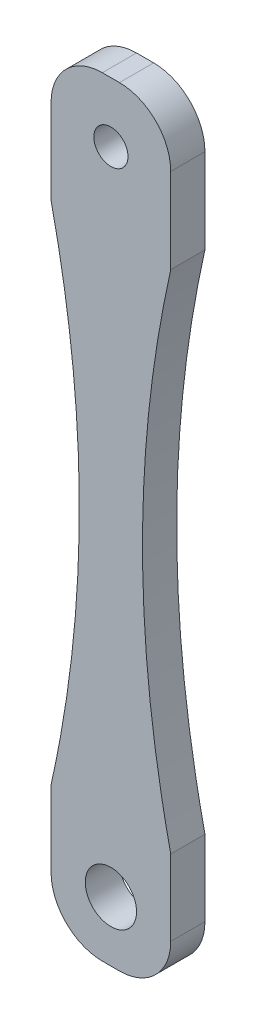
ISO-10303-21;
HEADER;
FILE_DESCRIPTION(('STEP AP214'),'2;1');
FILE_NAME('part.step','',(''),(''),'','','');
FILE_SCHEMA(('AUTOMOTIVE_DESIGN { 1 0 10303 214 1 1 1 1 }'));
ENDSEC;
DATA;
#1=APPLICATION_CONTEXT('core data for automotive mechanical design processes');
#2=APPLICATION_PROTOCOL_DEFINITION('international standard','automotive_design',2000,#1);
#3=PRODUCT_CONTEXT('',#1,'mechanical');
#4=PRODUCT('Part','Part','',(#3));
#5=PRODUCT_RELATED_PRODUCT_CATEGORY('part','',(#4));
#6=PRODUCT_DEFINITION_FORMATION('','',#4);
#7=PRODUCT_DEFINITION_CONTEXT('part definition',#1,'design');
#8=PRODUCT_DEFINITION('design','',#6,#7);
#9=PRODUCT_DEFINITION_SHAPE('','',#8);
#10=(LENGTH_UNIT() NAMED_UNIT(*) SI_UNIT(.MILLI.,.METRE.));
#11=(NAMED_UNIT(*) PLANE_ANGLE_UNIT() SI_UNIT($,.RADIAN.));
#12=(NAMED_UNIT(*) SI_UNIT($,.STERADIAN.) SOLID_ANGLE_UNIT());
#13=UNCERTAINTY_MEASURE_WITH_UNIT(LENGTH_MEASURE(1.E-05),#10,'distance_accuracy_value','');
#14=(GEOMETRIC_REPRESENTATION_CONTEXT(3) GLOBAL_UNCERTAINTY_ASSIGNED_CONTEXT((#13)) GLOBAL_UNIT_ASSIGNED_CONTEXT((#10,
#11,#12)) REPRESENTATION_CONTEXT('',''));
#15=CARTESIAN_POINT('',(0.,0.,0.));
#16=DIRECTION('',(0.,0.,1.));
#17=DIRECTION('',(1.,0.,0.));
#18=AXIS2_PLACEMENT_3D('',#15,#16,#17);
#19=CARTESIAN_POINT('',(3.5,19.5,2.));
#20=DIRECTION('',(-1.,0.,0.));
#21=DIRECTION('',(0.,-1.,0.));
#22=AXIS2_PLACEMENT_3D('',#19,#20,#21);
#23=PLANE('',#22);
#24=DIRECTION('',(0.,1.,0.));
#25=VECTOR('',#24,1.);
#26=CARTESIAN_POINT('',(3.5,19.5,2.));
#27=LINE('',#26,#25);
#28=CARTESIAN_POINT('',(3.5,14.5304638728839,2.));
#29=VERTEX_POINT('',#28);
#30=CARTESIAN_POINT('',(3.5,19.5,2.));
#31=VERTEX_POINT('',#30);
#32=EDGE_CURVE('E129',#29,#31,#27,.T.);
#33=ORIENTED_EDGE('',*,*,#32,.F.);
#34=DIRECTION('',(0.,0.,1.));
#35=VECTOR('',#34,1.);
#36=CARTESIAN_POINT('',(3.5,14.5304638728839,-12.));
#37=LINE('',#36,#35);
#38=CARTESIAN_POINT('',(3.5,14.5304638728839,0.));
#39=VERTEX_POINT('',#38);
#40=EDGE_CURVE('E11',#29,#39,#37,.F.);
#41=ORIENTED_EDGE('',*,*,#40,.T.);
#42=DIRECTION('',(0.,1.,0.));
#43=VECTOR('',#42,1.);
#44=CARTESIAN_POINT('',(3.5,19.5,0.));
#45=LINE('',#44,#43);
#46=CARTESIAN_POINT('',(3.5,19.5,0.));
#47=VERTEX_POINT('',#46);
#48=EDGE_CURVE('E162',#39,#47,#45,.T.);
#49=ORIENTED_EDGE('',*,*,#48,.T.);
#50=DIRECTION('',(0.,0.,-1.));
#51=VECTOR('',#50,1.);
#52=CARTESIAN_POINT('',(3.5,19.5,2.));
#53=LINE('',#52,#51);
#54=EDGE_CURVE('E135',#31,#47,#53,.T.);
#55=ORIENTED_EDGE('',*,*,#54,.F.);
#56=EDGE_LOOP('',(#33,#41,#49,#55));
#57=FACE_BOUND('',#56,.T.);
#58=ADVANCED_FACE('F33',(#57),#23,.F.);
#59=CARTESIAN_POINT('',(-0.499999999999998,-19.5,2.));
#60=DIRECTION('',(0.,0.,1.));
#61=DIRECTION('',(1.,0.,0.));
#62=AXIS2_PLACEMENT_3D('',#59,#60,#61);
#63=PLANE('',#62);
#64=CARTESIAN_POINT('',(3.5,14.5304638728839,2.));
#65=CARTESIAN_POINT('',(0.195046466559805,-0.263066887007442,2.));
#66=CARTESIAN_POINT('',(3.50000000000001,-15.0698812217126,2.));
#67=B_SPLINE_CURVE_WITH_KNOTS('',2,(#64,#65,#66),.UNSPECIFIED.,.F.,.F.,(3,3),(0.,1.),.UNSPECIFIED.);
#68=CARTESIAN_POINT('',(3.5,-15.0698812217126,2.));
#69=VERTEX_POINT('',#68);
#70=EDGE_CURVE('E48',#29,#69,#67,.T.);
#71=ORIENTED_EDGE('',*,*,#70,.F.);
#72=ORIENTED_EDGE('',*,*,#32,.T.);
#73=CARTESIAN_POINT('',(0.499999999999997,19.5,2.));
#74=DIRECTION('',(0.,0.,1.));
#75=DIRECTION('',(-1.,0.,0.));
#76=AXIS2_PLACEMENT_3D('',#73,#74,#75);
#77=CIRCLE('',#76,3.);
#78=CARTESIAN_POINT('',(0.499999999999976,22.5,2.));
#79=VERTEX_POINT('',#78);
#80=EDGE_CURVE('E139',#31,#79,#77,.T.);
#81=ORIENTED_EDGE('',*,*,#80,.T.);
#82=DIRECTION('',(-1.,0.,0.));
#83=VECTOR('',#82,1.);
#84=CARTESIAN_POINT('',(-0.499999999999982,22.5,2.));
#85=LINE('',#84,#83);
#86=CARTESIAN_POINT('',(-0.499999999999982,22.5,2.));
#87=VERTEX_POINT('',#86);
#88=EDGE_CURVE('E145',#79,#87,#85,.T.);
#89=ORIENTED_EDGE('',*,*,#88,.T.);
#90=CARTESIAN_POINT('',(-0.500000000000003,19.5,2.));
#91=DIRECTION('',(0.,0.,1.));
#92=DIRECTION('',(1.,0.,0.));
#93=AXIS2_PLACEMENT_3D('',#90,#91,#92);
#94=CIRCLE('',#93,3.);
#95=CARTESIAN_POINT('',(-3.5,19.5,2.));
#96=VERTEX_POINT('',#95);
#97=EDGE_CURVE('E147',#87,#96,#94,.T.);
#98=ORIENTED_EDGE('',*,*,#97,.T.);
#99=DIRECTION('',(0.,-1.,0.));
#100=VECTOR('',#99,1.);
#101=CARTESIAN_POINT('',(-3.5,19.5,2.));
#102=LINE('',#101,#100);
#103=CARTESIAN_POINT('',(-3.5,14.5304638728839,2.));
#104=VERTEX_POINT('',#103);
#105=EDGE_CURVE('E150',#96,#104,#102,.T.);
#106=ORIENTED_EDGE('',*,*,#105,.T.);
#107=CARTESIAN_POINT('',(-3.5,14.5304638728839,2.));
#108=CARTESIAN_POINT('',(-0.195046466559804,-0.263066887007443,2.));
#109=CARTESIAN_POINT('',(-3.5,-15.0698812217126,2.));
#110=B_SPLINE_CURVE_WITH_KNOTS('',2,(#107,#108,#109),.UNSPECIFIED.,.F.,.F.,(3,3),(0.,1.),.UNSPECIFIED.);
#111=CARTESIAN_POINT('',(-3.5,-15.0698812217126,2.));
#112=VERTEX_POINT('',#111);
#113=EDGE_CURVE('E208',#104,#112,#110,.T.);
#114=ORIENTED_EDGE('',*,*,#113,.T.);
#115=CARTESIAN_POINT('',(-3.5,-19.5,2.));
#116=VERTEX_POINT('',#115);
#117=EDGE_CURVE('E149',#112,#116,#102,.T.);
#118=ORIENTED_EDGE('',*,*,#117,.T.);
#119=CARTESIAN_POINT('',(-0.499999999999998,-19.5,2.));
#120=DIRECTION('',(0.,0.,1.));
#121=DIRECTION('',(1.,0.,0.));
#122=AXIS2_PLACEMENT_3D('',#119,#120,#121);
#123=CIRCLE('',#122,3.);
#124=CARTESIAN_POINT('',(-0.499999999999977,-22.5,2.));
#125=VERTEX_POINT('',#124);
#126=EDGE_CURVE('E176',#116,#125,#123,.T.);
#127=ORIENTED_EDGE('',*,*,#126,.T.);
#128=DIRECTION('',(1.,0.,0.));
#129=VECTOR('',#128,1.);
#130=CARTESIAN_POINT('',(-0.499999999999977,-22.5,2.));
#131=LINE('',#130,#129);
#132=CARTESIAN_POINT('',(0.49999999999998,-22.5,2.));
#133=VERTEX_POINT('',#132);
#134=EDGE_CURVE('E140',#125,#133,#131,.T.);
#135=ORIENTED_EDGE('',*,*,#134,.T.);
#136=CARTESIAN_POINT('',(0.500000000000002,-19.5,2.));
#137=DIRECTION('',(0.,0.,1.));
#138=DIRECTION('',(1.,0.,0.));
#139=AXIS2_PLACEMENT_3D('',#136,#137,#138);
#140=CIRCLE('',#139,3.);
#141=CARTESIAN_POINT('',(3.5,-19.5,2.));
#142=VERTEX_POINT('',#141);
#143=EDGE_CURVE('E137',#133,#142,#140,.T.);
#144=ORIENTED_EDGE('',*,*,#143,.T.);
#145=EDGE_CURVE('E132',#142,#69,#27,.T.);
#146=ORIENTED_EDGE('',*,*,#145,.T.);
#147=EDGE_LOOP('',(#71,#72,#81,#89,#98,#106,#114,#118,#127,#135,#144,#146));
#148=FACE_BOUND('',#147,.T.);
#149=CARTESIAN_POINT('',(0.,-19.,2.));
#150=DIRECTION('',(0.,0.,1.));
#151=DIRECTION('',(1.,0.,0.));
#152=AXIS2_PLACEMENT_3D('',#149,#150,#151);
#153=CIRCLE('',#152,1.5);
#154=CARTESIAN_POINT('',(1.5,-19.,2.));
#155=VERTEX_POINT('',#154);
#156=EDGE_CURVE('E388',#155,#155,#153,.T.);
#157=ORIENTED_EDGE('',*,*,#156,.F.);
#158=EDGE_LOOP('',(#157));
#159=FACE_BOUND('',#158,.T.);
#160=CARTESIAN_POINT('',(0.,19.,2.));
#161=DIRECTION('',(0.,0.,1.));
#162=DIRECTION('',(1.,0.,0.));
#163=AXIS2_PLACEMENT_3D('',#160,#161,#162);
#164=CIRCLE('',#163,1.);
#165=CARTESIAN_POINT('',(1.,19.,2.));
#166=VERTEX_POINT('',#165);
#167=EDGE_CURVE('E158',#166,#166,#164,.T.);
#168=ORIENTED_EDGE('',*,*,#167,.F.);
#169=EDGE_LOOP('',(#168));
#170=FACE_BOUND('',#169,.T.);
#171=ADVANCED_FACE('F127',(#148,#159,#170),#63,.T.);
#172=CARTESIAN_POINT('',(-0.499999999999998,-19.5,0.));
#173=DIRECTION('',(0.,0.,1.));
#174=DIRECTION('',(1.,0.,0.));
#175=AXIS2_PLACEMENT_3D('',#172,#173,#174);
#176=PLANE('',#175);
#177=CARTESIAN_POINT('',(0.,-19.,0.));
#178=DIRECTION('',(0.,0.,1.));
#179=DIRECTION('',(1.,0.,0.));
#180=AXIS2_PLACEMENT_3D('',#177,#178,#179);
#181=CIRCLE('',#180,1.5);
#182=CARTESIAN_POINT('',(1.5,-19.,0.));
#183=VERTEX_POINT('',#182);
#184=EDGE_CURVE('E391',#183,#183,#181,.T.);
#185=ORIENTED_EDGE('',*,*,#184,.T.);
#186=EDGE_LOOP('',(#185));
#187=FACE_BOUND('',#186,.T.);
#188=CARTESIAN_POINT('',(0.,19.,0.));
#189=DIRECTION('',(0.,0.,1.));
#190=DIRECTION('',(1.,0.,0.));
#191=AXIS2_PLACEMENT_3D('',#188,#189,#190);
#192=CIRCLE('',#191,1.);
#193=CARTESIAN_POINT('',(1.,19.,0.));
#194=VERTEX_POINT('',#193);
#195=EDGE_CURVE('E385',#194,#194,#192,.T.);
#196=ORIENTED_EDGE('',*,*,#195,.T.);
#197=EDGE_LOOP('',(#196));
#198=FACE_BOUND('',#197,.T.);
#199=ORIENTED_EDGE('',*,*,#48,.F.);
#200=CARTESIAN_POINT('',(3.5,14.5304638728839,0.));
#201=CARTESIAN_POINT('',(0.195046466559805,-0.263066887007442,0.));
#202=CARTESIAN_POINT('',(3.50000000000001,-15.0698812217126,0.));
#203=B_SPLINE_CURVE_WITH_KNOTS('',2,(#200,#201,#202),.UNSPECIFIED.,.F.,.F.,(3,3),(0.,1.),.UNSPECIFIED.);
#204=CARTESIAN_POINT('',(3.5,-15.0698812217126,0.));
#205=VERTEX_POINT('',#204);
#206=EDGE_CURVE('E121',#39,#205,#203,.T.);
#207=ORIENTED_EDGE('',*,*,#206,.T.);
#208=CARTESIAN_POINT('',(3.5,-19.5,0.));
#209=VERTEX_POINT('',#208);
#210=EDGE_CURVE('E163',#209,#205,#45,.T.);
#211=ORIENTED_EDGE('',*,*,#210,.F.);
#212=CARTESIAN_POINT('',(0.500000000000002,-19.5,0.));
#213=DIRECTION('',(0.,0.,1.));
#214=DIRECTION('',(1.,0.,0.));
#215=AXIS2_PLACEMENT_3D('',#212,#213,#214);
#216=CIRCLE('',#215,3.);
#217=CARTESIAN_POINT('',(0.49999999999998,-22.5,0.));
#218=VERTEX_POINT('',#217);
#219=EDGE_CURVE('E160',#218,#209,#216,.T.);
#220=ORIENTED_EDGE('',*,*,#219,.F.);
#221=DIRECTION('',(1.,0.,0.));
#222=VECTOR('',#221,1.);
#223=CARTESIAN_POINT('',(-0.499999999999977,-22.5,0.));
#224=LINE('',#223,#222);
#225=CARTESIAN_POINT('',(-0.499999999999977,-22.5,0.));
#226=VERTEX_POINT('',#225);
#227=EDGE_CURVE('E157',#226,#218,#224,.T.);
#228=ORIENTED_EDGE('',*,*,#227,.F.);
#229=CARTESIAN_POINT('',(-0.499999999999998,-19.5,0.));
#230=DIRECTION('',(0.,0.,1.));
#231=DIRECTION('',(1.,0.,0.));
#232=AXIS2_PLACEMENT_3D('',#229,#230,#231);
#233=CIRCLE('',#232,3.);
#234=CARTESIAN_POINT('',(-3.5,-19.5,0.));
#235=VERTEX_POINT('',#234);
#236=EDGE_CURVE('E154',#235,#226,#233,.T.);
#237=ORIENTED_EDGE('',*,*,#236,.F.);
#238=DIRECTION('',(0.,-1.,0.));
#239=VECTOR('',#238,1.);
#240=CARTESIAN_POINT('',(-3.5,19.5,0.));
#241=LINE('',#240,#239);
#242=CARTESIAN_POINT('',(-3.5,-15.0698812217126,0.));
#243=VERTEX_POINT('',#242);
#244=EDGE_CURVE('E172',#243,#235,#241,.T.);
#245=ORIENTED_EDGE('',*,*,#244,.F.);
#246=CARTESIAN_POINT('',(-3.5,14.5304638728839,0.));
#247=CARTESIAN_POINT('',(-0.195046466559804,-0.263066887007443,0.));
#248=CARTESIAN_POINT('',(-3.5,-15.0698812217126,0.));
#249=B_SPLINE_CURVE_WITH_KNOTS('',2,(#246,#247,#248),.UNSPECIFIED.,.F.,.F.,(3,3),(0.,1.),.UNSPECIFIED.);
#250=CARTESIAN_POINT('',(-3.5,14.5304638728839,0.));
#251=VERTEX_POINT('',#250);
#252=EDGE_CURVE('E56',#251,#243,#249,.T.);
#253=ORIENTED_EDGE('',*,*,#252,.F.);
#254=CARTESIAN_POINT('',(-3.5,19.5,0.));
#255=VERTEX_POINT('',#254);
#256=EDGE_CURVE('E173',#255,#251,#241,.T.);
#257=ORIENTED_EDGE('',*,*,#256,.F.);
#258=CARTESIAN_POINT('',(-0.500000000000003,19.5,0.));
#259=DIRECTION('',(0.,0.,1.));
#260=DIRECTION('',(1.,0.,0.));
#261=AXIS2_PLACEMENT_3D('',#258,#259,#260);
#262=CIRCLE('',#261,3.);
#263=CARTESIAN_POINT('',(-0.499999999999982,22.5,0.));
#264=VERTEX_POINT('',#263);
#265=EDGE_CURVE('E170',#264,#255,#262,.T.);
#266=ORIENTED_EDGE('',*,*,#265,.F.);
#267=DIRECTION('',(-1.,0.,0.));
#268=VECTOR('',#267,1.);
#269=CARTESIAN_POINT('',(-0.499999999999982,22.5,0.));
#270=LINE('',#269,#268);
#271=CARTESIAN_POINT('',(0.499999999999976,22.5,0.));
#272=VERTEX_POINT('',#271);
#273=EDGE_CURVE('E168',#272,#264,#270,.T.);
#274=ORIENTED_EDGE('',*,*,#273,.F.);
#275=CARTESIAN_POINT('',(0.499999999999997,19.5,0.));
#276=DIRECTION('',(0.,0.,1.));
#277=DIRECTION('',(-1.,0.,0.));
#278=AXIS2_PLACEMENT_3D('',#275,#276,#277);
#279=CIRCLE('',#278,3.);
#280=EDGE_CURVE('E166',#47,#272,#279,.T.);
#281=ORIENTED_EDGE('',*,*,#280,.F.);
#282=EDGE_LOOP('',(#199,#207,#211,#220,#228,#237,#245,#253,#257,#266,#274,#281));
#283=FACE_BOUND('',#282,.T.);
#284=ADVANCED_FACE('F205',(#187,#198,#283),#176,.F.);
#285=CARTESIAN_POINT('',(-3.5,19.5,2.));
#286=DIRECTION('',(1.,0.,0.));
#287=DIRECTION('',(0.,1.,0.));
#288=AXIS2_PLACEMENT_3D('',#285,#286,#287);
#289=PLANE('',#288);
#290=DIRECTION('',(0.,0.,1.));
#291=VECTOR('',#290,1.);
#292=CARTESIAN_POINT('',(-3.5,14.5304638728839,-12.));
#293=LINE('',#292,#291);
#294=EDGE_CURVE('E200',#104,#251,#293,.F.);
#295=ORIENTED_EDGE('',*,*,#294,.F.);
#296=ORIENTED_EDGE('',*,*,#105,.F.);
#297=DIRECTION('',(0.,0.,-1.));
#298=VECTOR('',#297,1.);
#299=CARTESIAN_POINT('',(-3.5,19.5,2.));
#300=LINE('',#299,#298);
#301=EDGE_CURVE('E179',#96,#255,#300,.T.);
#302=ORIENTED_EDGE('',*,*,#301,.T.);
#303=ORIENTED_EDGE('',*,*,#256,.T.);
#304=EDGE_LOOP('',(#295,#296,#302,#303));
#305=FACE_BOUND('',#304,.T.);
#306=ADVANCED_FACE('F248',(#305),#289,.F.);
#307=DIRECTION('',(0.,0.,1.));
#308=VECTOR('',#307,1.);
#309=CARTESIAN_POINT('',(-3.5,-15.0698812217126,-12.));
#310=LINE('',#309,#308);
#311=EDGE_CURVE('E198',#243,#112,#310,.T.);
#312=ORIENTED_EDGE('',*,*,#311,.F.);
#313=ORIENTED_EDGE('',*,*,#244,.T.);
#314=DIRECTION('',(0.,0.,-1.));
#315=VECTOR('',#314,1.);
#316=CARTESIAN_POINT('',(-3.5,-19.5,2.));
#317=LINE('',#316,#315);
#318=EDGE_CURVE('E153',#116,#235,#317,.T.);
#319=ORIENTED_EDGE('',*,*,#318,.F.);
#320=ORIENTED_EDGE('',*,*,#117,.F.);
#321=EDGE_LOOP('',(#312,#313,#319,#320));
#322=FACE_BOUND('',#321,.T.);
#323=ADVANCED_FACE('F252',(#322),#289,.F.);
#324=CARTESIAN_POINT('',(-0.499999999999998,-19.5,2.));
#325=DIRECTION('',(0.,0.,-1.));
#326=DIRECTION('',(-1.,0.,0.));
#327=AXIS2_PLACEMENT_3D('',#324,#325,#326);
#328=CYLINDRICAL_SURFACE('',#327,3.);
#329=ORIENTED_EDGE('',*,*,#236,.T.);
#330=DIRECTION('',(0.,0.,-1.));
#331=VECTOR('',#330,1.);
#332=CARTESIAN_POINT('',(-0.499999999999977,-22.5,2.));
#333=LINE('',#332,#331);
#334=EDGE_CURVE('E195',#125,#226,#333,.T.);
#335=ORIENTED_EDGE('',*,*,#334,.F.);
#336=ORIENTED_EDGE('',*,*,#126,.F.);
#337=ORIENTED_EDGE('',*,*,#318,.T.);
#338=EDGE_LOOP('',(#329,#335,#336,#337));
#339=FACE_BOUND('',#338,.T.);
#340=ADVANCED_FACE('F35',(#339),#328,.T.);
#341=CARTESIAN_POINT('',(-0.499999999999977,-22.5,2.));
#342=DIRECTION('',(0.,1.,0.));
#343=DIRECTION('',(0.,0.,1.));
#344=AXIS2_PLACEMENT_3D('',#341,#342,#343);
#345=PLANE('',#344);
#346=ORIENTED_EDGE('',*,*,#227,.T.);
#347=DIRECTION('',(0.,0.,-1.));
#348=VECTOR('',#347,1.);
#349=CARTESIAN_POINT('',(0.49999999999998,-22.5,2.));
#350=LINE('',#349,#348);
#351=EDGE_CURVE('E192',#133,#218,#350,.T.);
#352=ORIENTED_EDGE('',*,*,#351,.F.);
#353=ORIENTED_EDGE('',*,*,#134,.F.);
#354=ORIENTED_EDGE('',*,*,#334,.T.);
#355=EDGE_LOOP('',(#346,#352,#353,#354));
#356=FACE_BOUND('',#355,.T.);
#357=ADVANCED_FACE('F269',(#356),#345,.F.);
#358=CARTESIAN_POINT('',(0.500000000000002,-19.5,2.));
#359=DIRECTION('',(0.,0.,-1.));
#360=DIRECTION('',(-1.,0.,0.));
#361=AXIS2_PLACEMENT_3D('',#358,#359,#360);
#362=CYLINDRICAL_SURFACE('',#361,3.);
#363=ORIENTED_EDGE('',*,*,#219,.T.);
#364=DIRECTION('',(0.,0.,-1.));
#365=VECTOR('',#364,1.);
#366=CARTESIAN_POINT('',(3.5,-19.5,2.));
#367=LINE('',#366,#365);
#368=EDGE_CURVE('E189',#142,#209,#367,.T.);
#369=ORIENTED_EDGE('',*,*,#368,.F.);
#370=ORIENTED_EDGE('',*,*,#143,.F.);
#371=ORIENTED_EDGE('',*,*,#351,.T.);
#372=EDGE_LOOP('',(#363,#369,#370,#371));
#373=FACE_BOUND('',#372,.T.);
#374=ADVANCED_FACE('F267',(#373),#362,.T.);
#375=ORIENTED_EDGE('',*,*,#210,.T.);
#376=DIRECTION('',(0.,0.,1.));
#377=VECTOR('',#376,1.);
#378=CARTESIAN_POINT('',(3.50000000000001,-15.0698812217126,-12.));
#379=LINE('',#378,#377);
#380=EDGE_CURVE('E41',#205,#69,#379,.T.);
#381=ORIENTED_EDGE('',*,*,#380,.T.);
#382=ORIENTED_EDGE('',*,*,#145,.F.);
#383=ORIENTED_EDGE('',*,*,#368,.T.);
#384=EDGE_LOOP('',(#375,#381,#382,#383));
#385=FACE_BOUND('',#384,.T.);
#386=ADVANCED_FACE('F202',(#385),#23,.F.);
#387=CARTESIAN_POINT('',(0.499999999999997,19.5,2.));
#388=DIRECTION('',(0.,0.,-1.));
#389=DIRECTION('',(-1.,0.,0.));
#390=AXIS2_PLACEMENT_3D('',#387,#388,#389);
#391=CYLINDRICAL_SURFACE('',#390,3.);
#392=ORIENTED_EDGE('',*,*,#280,.T.);
#393=DIRECTION('',(0.,0.,-1.));
#394=VECTOR('',#393,1.);
#395=CARTESIAN_POINT('',(0.499999999999976,22.5,2.));
#396=LINE('',#395,#394);
#397=EDGE_CURVE('E185',#79,#272,#396,.T.);
#398=ORIENTED_EDGE('',*,*,#397,.F.);
#399=ORIENTED_EDGE('',*,*,#80,.F.);
#400=ORIENTED_EDGE('',*,*,#54,.T.);
#401=EDGE_LOOP('',(#392,#398,#399,#400));
#402=FACE_BOUND('',#401,.T.);
#403=ADVANCED_FACE('F260',(#402),#391,.T.);
#404=CARTESIAN_POINT('',(-0.499999999999982,22.5,2.));
#405=DIRECTION('',(0.,-1.,0.));
#406=DIRECTION('',(0.,0.,-1.));
#407=AXIS2_PLACEMENT_3D('',#404,#405,#406);
#408=PLANE('',#407);
#409=ORIENTED_EDGE('',*,*,#273,.T.);
#410=DIRECTION('',(0.,0.,-1.));
#411=VECTOR('',#410,1.);
#412=CARTESIAN_POINT('',(-0.499999999999982,22.5,2.));
#413=LINE('',#412,#411);
#414=EDGE_CURVE('E182',#87,#264,#413,.T.);
#415=ORIENTED_EDGE('',*,*,#414,.F.);
#416=ORIENTED_EDGE('',*,*,#88,.F.);
#417=ORIENTED_EDGE('',*,*,#397,.T.);
#418=EDGE_LOOP('',(#409,#415,#416,#417));
#419=FACE_BOUND('',#418,.T.);
#420=ADVANCED_FACE('F256',(#419),#408,.F.);
#421=CARTESIAN_POINT('',(-0.500000000000003,19.5,2.));
#422=DIRECTION('',(0.,0.,-1.));
#423=DIRECTION('',(-1.,0.,0.));
#424=AXIS2_PLACEMENT_3D('',#421,#422,#423);
#425=CYLINDRICAL_SURFACE('',#424,3.);
#426=ORIENTED_EDGE('',*,*,#265,.T.);
#427=ORIENTED_EDGE('',*,*,#301,.F.);
#428=ORIENTED_EDGE('',*,*,#97,.F.);
#429=ORIENTED_EDGE('',*,*,#414,.T.);
#430=EDGE_LOOP('',(#426,#427,#428,#429));
#431=FACE_BOUND('',#430,.T.);
#432=ADVANCED_FACE('F242',(#431),#425,.T.);
#433=CARTESIAN_POINT('',(0.,19.,2.));
#434=DIRECTION('',(0.,0.,-1.));
#435=DIRECTION('',(-1.,0.,0.));
#436=AXIS2_PLACEMENT_3D('',#433,#434,#435);
#437=CYLINDRICAL_SURFACE('',#436,1.);
#438=ORIENTED_EDGE('',*,*,#167,.T.);
#439=EDGE_LOOP('',(#438));
#440=FACE_BOUND('',#439,.T.);
#441=ORIENTED_EDGE('',*,*,#195,.F.);
#442=EDGE_LOOP('',(#441));
#443=FACE_BOUND('',#442,.T.);
#444=ADVANCED_FACE('F238',(#440,#443),#437,.F.);
#445=CARTESIAN_POINT('',(0.,-19.,2.));
#446=DIRECTION('',(0.,0.,-1.));
#447=DIRECTION('',(-1.,0.,0.));
#448=AXIS2_PLACEMENT_3D('',#445,#446,#447);
#449=CYLINDRICAL_SURFACE('',#448,1.5);
#450=ORIENTED_EDGE('',*,*,#156,.T.);
#451=EDGE_LOOP('',(#450));
#452=FACE_BOUND('',#451,.T.);
#453=ORIENTED_EDGE('',*,*,#184,.F.);
#454=EDGE_LOOP('',(#453));
#455=FACE_BOUND('',#454,.T.);
#456=ADVANCED_FACE('F235',(#452,#455),#449,.F.);
#457=CARTESIAN_POINT('',(-3.5,14.5304638728839,-12.));
#458=CARTESIAN_POINT('',(-0.195046466559804,-0.263066887007443,-12.));
#459=CARTESIAN_POINT('',(-3.5,-15.0698812217126,-12.));
#460=B_SPLINE_CURVE_WITH_KNOTS('',2,(#457,#458,#459),.UNSPECIFIED.,.F.,.F.,(3,3),(0.,1.),.UNSPECIFIED.);
#461=DIRECTION('',(0.,0.,1.));
#462=VECTOR('',#461,1.);
#463=SURFACE_OF_LINEAR_EXTRUSION('',#460,#462);
#464=ORIENTED_EDGE('',*,*,#252,.T.);
#465=ORIENTED_EDGE('',*,*,#311,.T.);
#466=ORIENTED_EDGE('',*,*,#113,.F.);
#467=ORIENTED_EDGE('',*,*,#294,.T.);
#468=EDGE_LOOP('',(#464,#465,#466,#467));
#469=FACE_BOUND('',#468,.T.);
#470=ADVANCED_FACE('F231',(#469),#463,.T.);
#471=CARTESIAN_POINT('',(3.5,14.5304638728839,-12.));
#472=CARTESIAN_POINT('',(0.195046466559805,-0.263066887007442,-12.));
#473=CARTESIAN_POINT('',(3.50000000000001,-15.0698812217126,-12.));
#474=B_SPLINE_CURVE_WITH_KNOTS('',2,(#471,#472,#473),.UNSPECIFIED.,.F.,.F.,(3,3),(0.,1.),.UNSPECIFIED.);
#475=DIRECTION('',(0.,0.,1.));
#476=VECTOR('',#475,1.);
#477=SURFACE_OF_LINEAR_EXTRUSION('',#474,#476);
#478=ORIENTED_EDGE('',*,*,#40,.F.);
#479=ORIENTED_EDGE('',*,*,#70,.T.);
#480=ORIENTED_EDGE('',*,*,#380,.F.);
#481=ORIENTED_EDGE('',*,*,#206,.F.);
#482=EDGE_LOOP('',(#478,#479,#480,#481));
#483=FACE_BOUND('',#482,.T.);
#484=ADVANCED_FACE('F119',(#483),#477,.F.);
#485=CLOSED_SHELL('',(#58,#171,#284,#306,#323,#340,#357,#374,#386,#403,#420,#432,#444,#456,#470,#484));
#486=MANIFOLD_SOLID_BREP('B2',#485);
#487=ADVANCED_BREP_SHAPE_REPRESENTATION('',(#18,#486),#14);
#488=SHAPE_DEFINITION_REPRESENTATION(#9,#487);
ENDSEC;
END-ISO-10303-21;
